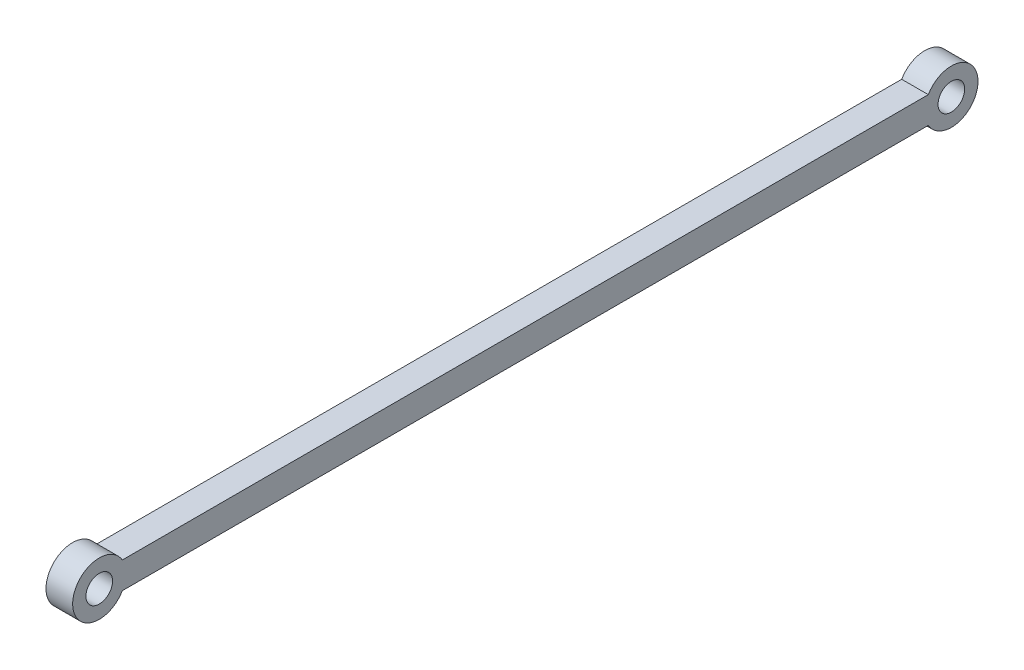
ISO-10303-21;
HEADER;
FILE_DESCRIPTION(('STEP AP214'),'2;1');
FILE_NAME('part.step','',(''),(''),'','','');
FILE_SCHEMA(('AUTOMOTIVE_DESIGN { 1 0 10303 214 1 1 1 1 }'));
ENDSEC;
DATA;
#1=APPLICATION_CONTEXT('core data for automotive mechanical design processes');
#2=APPLICATION_PROTOCOL_DEFINITION('international standard','automotive_design',2000,#1);
#3=PRODUCT_CONTEXT('',#1,'mechanical');
#4=PRODUCT('Part','Part','',(#3));
#5=PRODUCT_RELATED_PRODUCT_CATEGORY('part','',(#4));
#6=PRODUCT_DEFINITION_FORMATION('','',#4);
#7=PRODUCT_DEFINITION_CONTEXT('part definition',#1,'design');
#8=PRODUCT_DEFINITION('design','',#6,#7);
#9=PRODUCT_DEFINITION_SHAPE('','',#8);
#10=(LENGTH_UNIT() NAMED_UNIT(*) SI_UNIT(.MILLI.,.METRE.));
#11=(NAMED_UNIT(*) PLANE_ANGLE_UNIT() SI_UNIT($,.RADIAN.));
#12=(NAMED_UNIT(*) SI_UNIT($,.STERADIAN.) SOLID_ANGLE_UNIT());
#13=UNCERTAINTY_MEASURE_WITH_UNIT(LENGTH_MEASURE(1.E-05),#10,'distance_accuracy_value','');
#14=(GEOMETRIC_REPRESENTATION_CONTEXT(3) GLOBAL_UNCERTAINTY_ASSIGNED_CONTEXT((#13)) GLOBAL_UNIT_ASSIGNED_CONTEXT((#10,
#11,#12)) REPRESENTATION_CONTEXT('',''));
#15=CARTESIAN_POINT('',(0.,0.,0.));
#16=DIRECTION('',(0.,0.,1.));
#17=DIRECTION('',(1.,0.,0.));
#18=AXIS2_PLACEMENT_3D('',#15,#16,#17);
#19=CARTESIAN_POINT('',(2.5,0.,40.));
#20=DIRECTION('',(1.,0.,0.));
#21=DIRECTION('',(0.,0.,-1.));
#22=AXIS2_PLACEMENT_3D('',#19,#20,#21);
#23=PLANE('',#22);
#24=CARTESIAN_POINT('',(2.5,0.,40.));
#25=DIRECTION('',(1.,0.,0.));
#26=DIRECTION('',(0.,0.,-1.));
#27=AXIS2_PLACEMENT_3D('',#24,#25,#26);
#28=CIRCLE('',#27,1.25);
#29=CARTESIAN_POINT('',(2.5,0.,38.75));
#30=VERTEX_POINT('',#29);
#31=EDGE_CURVE('E104',#30,#30,#28,.T.);
#32=ORIENTED_EDGE('',*,*,#31,.F.);
#33=EDGE_LOOP('',(#32));
#34=FACE_BOUND('',#33,.T.);
#35=CARTESIAN_POINT('',(2.5,0.,40.));
#36=DIRECTION('',(1.,0.,0.));
#37=DIRECTION('',(0.,0.,-1.));
#38=AXIS2_PLACEMENT_3D('',#35,#36,#37);
#39=CIRCLE('',#38,2.5);
#40=CARTESIAN_POINT('',(2.5,1.25,37.8349364905389));
#41=VERTEX_POINT('',#40);
#42=CARTESIAN_POINT('',(2.5,-1.25,37.8349364905389));
#43=VERTEX_POINT('',#42);
#44=EDGE_CURVE('E89',#41,#43,#39,.T.);
#45=ORIENTED_EDGE('',*,*,#44,.T.);
#46=DIRECTION('',(0.,0.,-1.));
#47=VECTOR('',#46,1.);
#48=CARTESIAN_POINT('',(2.5,-1.25,37.8349364905389));
#49=LINE('',#48,#47);
#50=CARTESIAN_POINT('',(2.5,-1.25,-37.8349364905389));
#51=VERTEX_POINT('',#50);
#52=EDGE_CURVE('E84',#43,#51,#49,.T.);
#53=ORIENTED_EDGE('',*,*,#52,.T.);
#54=CARTESIAN_POINT('',(2.5,0.,-40.));
#55=DIRECTION('',(1.,0.,0.));
#56=DIRECTION('',(0.,0.,-1.));
#57=AXIS2_PLACEMENT_3D('',#54,#55,#56);
#58=CIRCLE('',#57,2.5);
#59=CARTESIAN_POINT('',(2.5,1.25,-37.8349364905389));
#60=VERTEX_POINT('',#59);
#61=EDGE_CURVE('E87',#51,#60,#58,.T.);
#62=ORIENTED_EDGE('',*,*,#61,.T.);
#63=DIRECTION('',(0.,0.,1.));
#64=VECTOR('',#63,1.);
#65=CARTESIAN_POINT('',(2.5,1.25,37.8349364905389));
#66=LINE('',#65,#64);
#67=EDGE_CURVE('E54',#60,#41,#66,.T.);
#68=ORIENTED_EDGE('',*,*,#67,.T.);
#69=EDGE_LOOP('',(#45,#53,#62,#68));
#70=FACE_BOUND('',#69,.T.);
#71=CARTESIAN_POINT('',(2.5,0.,-40.));
#72=DIRECTION('',(1.,0.,0.));
#73=DIRECTION('',(0.,0.,-1.));
#74=AXIS2_PLACEMENT_3D('',#71,#72,#73);
#75=CIRCLE('',#74,1.25);
#76=CARTESIAN_POINT('',(2.5,0.,-41.25));
#77=VERTEX_POINT('',#76);
#78=EDGE_CURVE('E119',#77,#77,#75,.T.);
#79=ORIENTED_EDGE('',*,*,#78,.F.);
#80=EDGE_LOOP('',(#79));
#81=FACE_BOUND('',#80,.T.);
#82=ADVANCED_FACE('F37',(#34,#70,#81),#23,.T.);
#83=CARTESIAN_POINT('',(0.,0.,40.));
#84=DIRECTION('',(1.,0.,0.));
#85=DIRECTION('',(0.,0.,-1.));
#86=AXIS2_PLACEMENT_3D('',#83,#84,#85);
#87=PLANE('',#86);
#88=CARTESIAN_POINT('',(0.,0.,40.));
#89=DIRECTION('',(1.,0.,0.));
#90=DIRECTION('',(0.,0.,-1.));
#91=AXIS2_PLACEMENT_3D('',#88,#89,#90);
#92=CIRCLE('',#91,2.5);
#93=CARTESIAN_POINT('',(0.,1.25,37.8349364905389));
#94=VERTEX_POINT('',#93);
#95=CARTESIAN_POINT('',(0.,-1.25,37.8349364905389));
#96=VERTEX_POINT('',#95);
#97=EDGE_CURVE('E101',#94,#96,#92,.T.);
#98=ORIENTED_EDGE('',*,*,#97,.F.);
#99=DIRECTION('',(0.,0.,1.));
#100=VECTOR('',#99,1.);
#101=CARTESIAN_POINT('',(0.,1.25,37.8349364905389));
#102=LINE('',#101,#100);
#103=CARTESIAN_POINT('',(0.,1.25,-37.8349364905389));
#104=VERTEX_POINT('',#103);
#105=EDGE_CURVE('E77',#104,#94,#102,.T.);
#106=ORIENTED_EDGE('',*,*,#105,.F.);
#107=CARTESIAN_POINT('',(0.,0.,-40.));
#108=DIRECTION('',(1.,0.,0.));
#109=DIRECTION('',(0.,0.,-1.));
#110=AXIS2_PLACEMENT_3D('',#107,#108,#109);
#111=CIRCLE('',#110,2.5);
#112=CARTESIAN_POINT('',(0.,-1.25,-37.8349364905389));
#113=VERTEX_POINT('',#112);
#114=EDGE_CURVE('E71',#113,#104,#111,.T.);
#115=ORIENTED_EDGE('',*,*,#114,.F.);
#116=DIRECTION('',(0.,0.,-1.));
#117=VECTOR('',#116,1.);
#118=CARTESIAN_POINT('',(0.,-1.25,37.8349364905389));
#119=LINE('',#118,#117);
#120=EDGE_CURVE('E93',#96,#113,#119,.T.);
#121=ORIENTED_EDGE('',*,*,#120,.F.);
#122=EDGE_LOOP('',(#98,#106,#115,#121));
#123=FACE_BOUND('',#122,.T.);
#124=CARTESIAN_POINT('',(0.,0.,40.));
#125=DIRECTION('',(1.,0.,0.));
#126=DIRECTION('',(0.,0.,-1.));
#127=AXIS2_PLACEMENT_3D('',#124,#125,#126);
#128=CIRCLE('',#127,1.25);
#129=CARTESIAN_POINT('',(0.,0.,38.75));
#130=VERTEX_POINT('',#129);
#131=EDGE_CURVE('E116',#130,#130,#128,.T.);
#132=ORIENTED_EDGE('',*,*,#131,.T.);
#133=EDGE_LOOP('',(#132));
#134=FACE_BOUND('',#133,.T.);
#135=CARTESIAN_POINT('',(0.,0.,-40.));
#136=DIRECTION('',(1.,0.,0.));
#137=DIRECTION('',(0.,0.,-1.));
#138=AXIS2_PLACEMENT_3D('',#135,#136,#137);
#139=CIRCLE('',#138,1.25);
#140=CARTESIAN_POINT('',(0.,0.,-41.25));
#141=VERTEX_POINT('',#140);
#142=EDGE_CURVE('E122',#141,#141,#139,.T.);
#143=ORIENTED_EDGE('',*,*,#142,.T.);
#144=EDGE_LOOP('',(#143));
#145=FACE_BOUND('',#144,.T.);
#146=ADVANCED_FACE('F112',(#123,#134,#145),#87,.F.);
#147=CARTESIAN_POINT('',(2.5,0.,40.));
#148=DIRECTION('',(-1.,0.,0.));
#149=DIRECTION('',(0.,0.,1.));
#150=AXIS2_PLACEMENT_3D('',#147,#148,#149);
#151=CYLINDRICAL_SURFACE('',#150,2.5);
#152=ORIENTED_EDGE('',*,*,#97,.T.);
#153=DIRECTION('',(-1.,0.,0.));
#154=VECTOR('',#153,1.);
#155=CARTESIAN_POINT('',(2.5,-1.25,37.8349364905389));
#156=LINE('',#155,#154);
#157=EDGE_CURVE('E11',#43,#96,#156,.T.);
#158=ORIENTED_EDGE('',*,*,#157,.F.);
#159=ORIENTED_EDGE('',*,*,#44,.F.);
#160=DIRECTION('',(-1.,0.,0.));
#161=VECTOR('',#160,1.);
#162=CARTESIAN_POINT('',(2.5,1.25,37.8349364905389));
#163=LINE('',#162,#161);
#164=EDGE_CURVE('E97',#41,#94,#163,.T.);
#165=ORIENTED_EDGE('',*,*,#164,.T.);
#166=EDGE_LOOP('',(#152,#158,#159,#165));
#167=FACE_BOUND('',#166,.T.);
#168=ADVANCED_FACE('F39',(#167),#151,.T.);
#169=CARTESIAN_POINT('',(2.5,-1.25,37.8349364905389));
#170=DIRECTION('',(0.,1.,0.));
#171=DIRECTION('',(0.,0.,1.));
#172=AXIS2_PLACEMENT_3D('',#169,#170,#171);
#173=PLANE('',#172);
#174=ORIENTED_EDGE('',*,*,#120,.T.);
#175=DIRECTION('',(-1.,0.,0.));
#176=VECTOR('',#175,1.);
#177=CARTESIAN_POINT('',(2.5,-1.25,-37.8349364905389));
#178=LINE('',#177,#176);
#179=EDGE_CURVE('E46',#51,#113,#178,.T.);
#180=ORIENTED_EDGE('',*,*,#179,.F.);
#181=ORIENTED_EDGE('',*,*,#52,.F.);
#182=ORIENTED_EDGE('',*,*,#157,.T.);
#183=EDGE_LOOP('',(#174,#180,#181,#182));
#184=FACE_BOUND('',#183,.T.);
#185=ADVANCED_FACE('F92',(#184),#173,.F.);
#186=CARTESIAN_POINT('',(2.5,0.,-40.));
#187=DIRECTION('',(-1.,0.,0.));
#188=DIRECTION('',(0.,0.,1.));
#189=AXIS2_PLACEMENT_3D('',#186,#187,#188);
#190=CYLINDRICAL_SURFACE('',#189,2.5);
#191=ORIENTED_EDGE('',*,*,#114,.T.);
#192=DIRECTION('',(-1.,0.,0.));
#193=VECTOR('',#192,1.);
#194=CARTESIAN_POINT('',(2.5,1.25,-37.8349364905389));
#195=LINE('',#194,#193);
#196=EDGE_CURVE('E94',#60,#104,#195,.T.);
#197=ORIENTED_EDGE('',*,*,#196,.F.);
#198=ORIENTED_EDGE('',*,*,#61,.F.);
#199=ORIENTED_EDGE('',*,*,#179,.T.);
#200=EDGE_LOOP('',(#191,#197,#198,#199));
#201=FACE_BOUND('',#200,.T.);
#202=ADVANCED_FACE('F95',(#201),#190,.T.);
#203=CARTESIAN_POINT('',(2.5,1.25,37.8349364905389));
#204=DIRECTION('',(0.,-1.,0.));
#205=DIRECTION('',(0.,0.,-1.));
#206=AXIS2_PLACEMENT_3D('',#203,#204,#205);
#207=PLANE('',#206);
#208=ORIENTED_EDGE('',*,*,#105,.T.);
#209=ORIENTED_EDGE('',*,*,#164,.F.);
#210=ORIENTED_EDGE('',*,*,#67,.F.);
#211=ORIENTED_EDGE('',*,*,#196,.T.);
#212=EDGE_LOOP('',(#208,#209,#210,#211));
#213=FACE_BOUND('',#212,.T.);
#214=ADVANCED_FACE('F109',(#213),#207,.F.);
#215=CARTESIAN_POINT('',(2.5,0.,40.));
#216=DIRECTION('',(-1.,0.,0.));
#217=DIRECTION('',(0.,0.,1.));
#218=AXIS2_PLACEMENT_3D('',#215,#216,#217);
#219=CYLINDRICAL_SURFACE('',#218,1.25);
#220=ORIENTED_EDGE('',*,*,#31,.T.);
#221=EDGE_LOOP('',(#220));
#222=FACE_BOUND('',#221,.T.);
#223=ORIENTED_EDGE('',*,*,#131,.F.);
#224=EDGE_LOOP('',(#223));
#225=FACE_BOUND('',#224,.T.);
#226=ADVANCED_FACE('F139',(#222,#225),#219,.F.);
#227=CARTESIAN_POINT('',(2.5,0.,-40.));
#228=DIRECTION('',(-1.,0.,0.));
#229=DIRECTION('',(0.,0.,1.));
#230=AXIS2_PLACEMENT_3D('',#227,#228,#229);
#231=CYLINDRICAL_SURFACE('',#230,1.25);
#232=ORIENTED_EDGE('',*,*,#78,.T.);
#233=EDGE_LOOP('',(#232));
#234=FACE_BOUND('',#233,.T.);
#235=ORIENTED_EDGE('',*,*,#142,.F.);
#236=EDGE_LOOP('',(#235));
#237=FACE_BOUND('',#236,.T.);
#238=ADVANCED_FACE('F128',(#234,#237),#231,.F.);
#239=CLOSED_SHELL('',(#82,#146,#168,#185,#202,#214,#226,#238));
#240=MANIFOLD_SOLID_BREP('B2',#239);
#241=ADVANCED_BREP_SHAPE_REPRESENTATION('',(#18,#240),#14);
#242=SHAPE_DEFINITION_REPRESENTATION(#9,#241);
ENDSEC;
END-ISO-10303-21;
